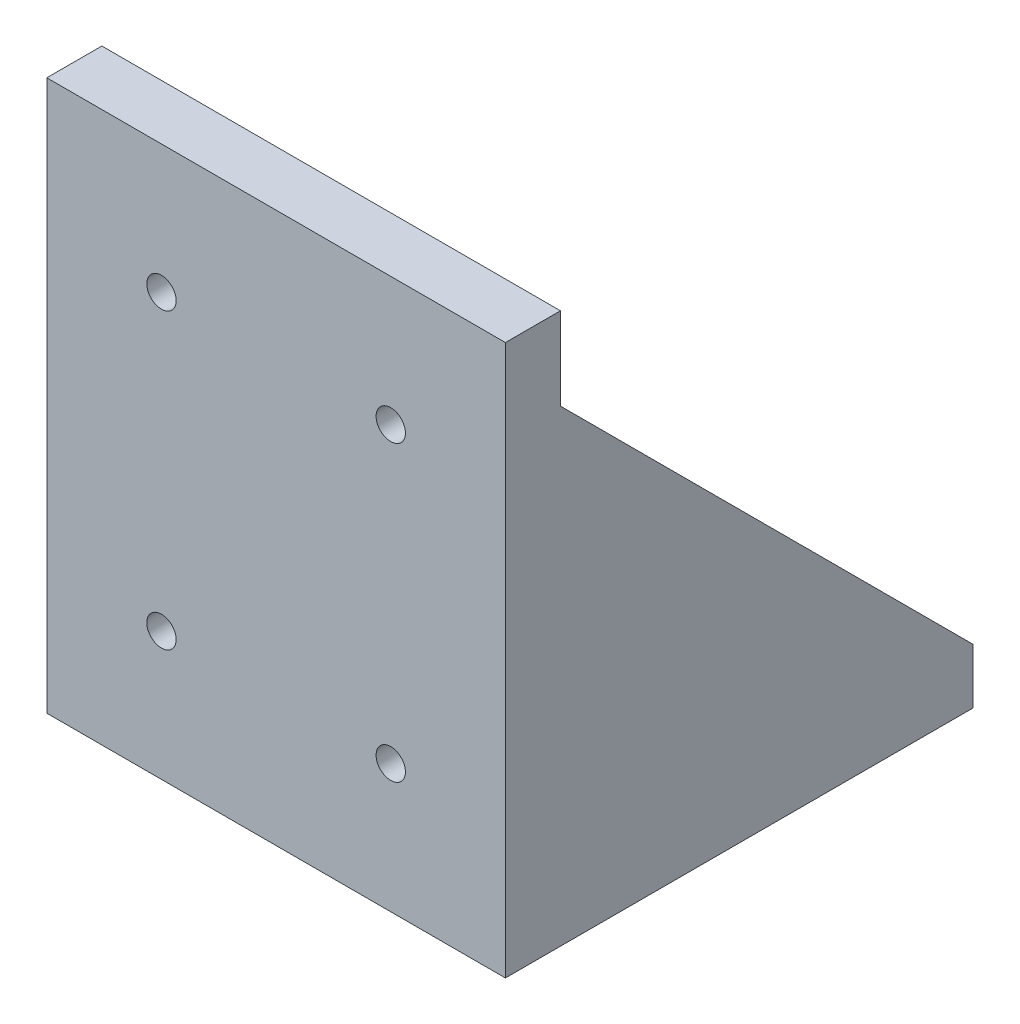
ISO-10303-21;
HEADER;
FILE_DESCRIPTION(('STEP AP214'),'2;1');
FILE_NAME('part.step','',(''),(''),'','','');
FILE_SCHEMA(('AUTOMOTIVE_DESIGN { 1 0 10303 214 1 1 1 1 }'));
ENDSEC;
DATA;
#1=APPLICATION_CONTEXT('core data for automotive mechanical design processes');
#2=APPLICATION_PROTOCOL_DEFINITION('international standard','automotive_design',2000,#1);
#3=PRODUCT_CONTEXT('',#1,'mechanical');
#4=PRODUCT('Part','Part','',(#3));
#5=PRODUCT_RELATED_PRODUCT_CATEGORY('part','',(#4));
#6=PRODUCT_DEFINITION_FORMATION('','',#4);
#7=PRODUCT_DEFINITION_CONTEXT('part definition',#1,'design');
#8=PRODUCT_DEFINITION('design','',#6,#7);
#9=PRODUCT_DEFINITION_SHAPE('','',#8);
#10=(LENGTH_UNIT() NAMED_UNIT(*) SI_UNIT(.MILLI.,.METRE.));
#11=(NAMED_UNIT(*) PLANE_ANGLE_UNIT() SI_UNIT($,.RADIAN.));
#12=(NAMED_UNIT(*) SI_UNIT($,.STERADIAN.) SOLID_ANGLE_UNIT());
#13=UNCERTAINTY_MEASURE_WITH_UNIT(LENGTH_MEASURE(1.E-05),#10,'distance_accuracy_value','');
#14=(GEOMETRIC_REPRESENTATION_CONTEXT(3) GLOBAL_UNCERTAINTY_ASSIGNED_CONTEXT((#13)) GLOBAL_UNIT_ASSIGNED_CONTEXT((#10,
#11,#12)) REPRESENTATION_CONTEXT('',''));
#15=CARTESIAN_POINT('',(0.,0.,0.));
#16=DIRECTION('',(0.,0.,1.));
#17=DIRECTION('',(1.,0.,0.));
#18=AXIS2_PLACEMENT_3D('',#15,#16,#17);
#19=CARTESIAN_POINT('',(12.5,46.,27.2));
#20=DIRECTION('',(0.,0.,-1.));
#21=DIRECTION('',(-1.,0.,0.));
#22=AXIS2_PLACEMENT_3D('',#19,#20,#21);
#23=CYLINDRICAL_SURFACE('',#22,1.6);
#24=CARTESIAN_POINT('',(12.5,46.,27.2));
#25=DIRECTION('',(0.,0.,-1.));
#26=DIRECTION('',(-1.,0.,0.));
#27=AXIS2_PLACEMENT_3D('',#24,#25,#26);
#28=CIRCLE('',#27,1.6);
#29=CARTESIAN_POINT('',(10.9,46.,27.2));
#30=VERTEX_POINT('',#29);
#31=EDGE_CURVE('E173',#30,#30,#28,.T.);
#32=ORIENTED_EDGE('',*,*,#31,.F.);
#33=EDGE_LOOP('',(#32));
#34=FACE_BOUND('',#33,.T.);
#35=CARTESIAN_POINT('',(12.5,46.,23.2));
#36=DIRECTION('',(0.,0.,-1.));
#37=DIRECTION('',(-1.,0.,0.));
#38=AXIS2_PLACEMENT_3D('',#35,#36,#37);
#39=CIRCLE('',#38,1.6);
#40=CARTESIAN_POINT('',(10.9,46.,23.2));
#41=VERTEX_POINT('',#40);
#42=EDGE_CURVE('E41',#41,#41,#39,.F.);
#43=ORIENTED_EDGE('',*,*,#42,.F.);
#44=EDGE_LOOP('',(#43));
#45=FACE_BOUND('',#44,.T.);
#46=ADVANCED_FACE('F37',(#34,#45),#23,.F.);
#47=CARTESIAN_POINT('',(12.5,14.,27.2));
#48=DIRECTION('',(0.,0.,-1.));
#49=DIRECTION('',(-1.,0.,0.));
#50=AXIS2_PLACEMENT_3D('',#47,#48,#49);
#51=CYLINDRICAL_SURFACE('',#50,1.6);
#52=CARTESIAN_POINT('',(12.5,14.,27.2));
#53=DIRECTION('',(0.,0.,-1.));
#54=DIRECTION('',(-1.,0.,0.));
#55=AXIS2_PLACEMENT_3D('',#52,#53,#54);
#56=CIRCLE('',#55,1.6);
#57=CARTESIAN_POINT('',(10.9,14.,27.2));
#58=VERTEX_POINT('',#57);
#59=EDGE_CURVE('E169',#58,#58,#56,.T.);
#60=ORIENTED_EDGE('',*,*,#59,.F.);
#61=EDGE_LOOP('',(#60));
#62=FACE_BOUND('',#61,.T.);
#63=CARTESIAN_POINT('',(12.5,14.,23.2));
#64=DIRECTION('',(0.,0.,-1.));
#65=DIRECTION('',(-1.,0.,0.));
#66=AXIS2_PLACEMENT_3D('',#63,#64,#65);
#67=CIRCLE('',#66,1.6);
#68=CARTESIAN_POINT('',(10.9,14.,23.2));
#69=VERTEX_POINT('',#68);
#70=EDGE_CURVE('E155',#69,#69,#67,.F.);
#71=ORIENTED_EDGE('',*,*,#70,.F.);
#72=EDGE_LOOP('',(#71));
#73=FACE_BOUND('',#72,.T.);
#74=ADVANCED_FACE('F266',(#62,#73),#51,.F.);
#75=CARTESIAN_POINT('',(-12.5,14.,27.2));
#76=DIRECTION('',(0.,0.,-1.));
#77=DIRECTION('',(-1.,0.,0.));
#78=AXIS2_PLACEMENT_3D('',#75,#76,#77);
#79=CYLINDRICAL_SURFACE('',#78,1.60000000000001);
#80=CARTESIAN_POINT('',(-12.5,14.,27.2));
#81=DIRECTION('',(0.,0.,-1.));
#82=DIRECTION('',(1.,0.,0.));
#83=AXIS2_PLACEMENT_3D('',#80,#81,#82);
#84=CIRCLE('',#83,1.60000000000001);
#85=CARTESIAN_POINT('',(-10.9,14.,27.2));
#86=VERTEX_POINT('',#85);
#87=EDGE_CURVE('E164',#86,#86,#84,.T.);
#88=ORIENTED_EDGE('',*,*,#87,.F.);
#89=EDGE_LOOP('',(#88));
#90=FACE_BOUND('',#89,.T.);
#91=CARTESIAN_POINT('',(-12.5,14.,23.2));
#92=DIRECTION('',(0.,0.,-1.));
#93=DIRECTION('',(-1.,0.,0.));
#94=AXIS2_PLACEMENT_3D('',#91,#92,#93);
#95=CIRCLE('',#94,1.60000000000001);
#96=CARTESIAN_POINT('',(-14.1,14.,23.2));
#97=VERTEX_POINT('',#96);
#98=EDGE_CURVE('E152',#97,#97,#95,.F.);
#99=ORIENTED_EDGE('',*,*,#98,.F.);
#100=EDGE_LOOP('',(#99));
#101=FACE_BOUND('',#100,.T.);
#102=ADVANCED_FACE('F272',(#90,#101),#79,.F.);
#103=CARTESIAN_POINT('',(-12.5,46.,27.2));
#104=DIRECTION('',(0.,0.,-1.));
#105=DIRECTION('',(-1.,0.,0.));
#106=AXIS2_PLACEMENT_3D('',#103,#104,#105);
#107=CYLINDRICAL_SURFACE('',#106,1.60000000000002);
#108=CARTESIAN_POINT('',(-12.5,46.,27.2));
#109=DIRECTION('',(0.,0.,-1.));
#110=DIRECTION('',(1.,0.,0.));
#111=AXIS2_PLACEMENT_3D('',#108,#109,#110);
#112=CIRCLE('',#111,1.60000000000002);
#113=CARTESIAN_POINT('',(-10.9,46.,27.2));
#114=VERTEX_POINT('',#113);
#115=EDGE_CURVE('E160',#114,#114,#112,.T.);
#116=ORIENTED_EDGE('',*,*,#115,.F.);
#117=EDGE_LOOP('',(#116));
#118=FACE_BOUND('',#117,.T.);
#119=CARTESIAN_POINT('',(-12.5,46.,23.2));
#120=DIRECTION('',(0.,0.,-1.));
#121=DIRECTION('',(-1.,0.,0.));
#122=AXIS2_PLACEMENT_3D('',#119,#120,#121);
#123=CIRCLE('',#122,1.60000000000002);
#124=CARTESIAN_POINT('',(-14.1,46.,23.2));
#125=VERTEX_POINT('',#124);
#126=EDGE_CURVE('E149',#125,#125,#123,.F.);
#127=ORIENTED_EDGE('',*,*,#126,.F.);
#128=EDGE_LOOP('',(#127));
#129=FACE_BOUND('',#128,.T.);
#130=ADVANCED_FACE('F279',(#118,#129),#107,.F.);
#131=CARTESIAN_POINT('',(0.,6.,0.));
#132=DIRECTION('',(0.,1.,0.));
#133=DIRECTION('',(0.,0.,1.));
#134=AXIS2_PLACEMENT_3D('',#131,#132,#133);
#135=PLANE('',#134);
#136=CARTESIAN_POINT('',(-15.5,6.,15.5));
#137=DIRECTION('',(0.,1.,0.));
#138=DIRECTION('',(0.,0.,1.));
#139=AXIS2_PLACEMENT_3D('',#136,#137,#138);
#140=CIRCLE('',#139,1.65);
#141=CARTESIAN_POINT('',(-15.5,6.,17.15));
#142=VERTEX_POINT('',#141);
#143=EDGE_CURVE('E225',#142,#142,#140,.T.);
#144=ORIENTED_EDGE('',*,*,#143,.F.);
#145=EDGE_LOOP('',(#144));
#146=FACE_BOUND('',#145,.T.);
#147=CARTESIAN_POINT('',(15.5,6.,-15.5));
#148=DIRECTION('',(0.,1.,0.));
#149=DIRECTION('',(0.,0.,1.));
#150=AXIS2_PLACEMENT_3D('',#147,#148,#149);
#151=CIRCLE('',#150,1.65);
#152=CARTESIAN_POINT('',(15.5,6.,-13.85));
#153=VERTEX_POINT('',#152);
#154=EDGE_CURVE('E237',#153,#153,#151,.T.);
#155=ORIENTED_EDGE('',*,*,#154,.F.);
#156=EDGE_LOOP('',(#155));
#157=FACE_BOUND('',#156,.T.);
#158=CARTESIAN_POINT('',(-15.5,6.,-15.5));
#159=DIRECTION('',(0.,1.,0.));
#160=DIRECTION('',(0.,0.,1.));
#161=AXIS2_PLACEMENT_3D('',#158,#159,#160);
#162=CIRCLE('',#161,1.65);
#163=CARTESIAN_POINT('',(-15.5,6.,-13.85));
#164=VERTEX_POINT('',#163);
#165=EDGE_CURVE('E146',#164,#164,#162,.T.);
#166=ORIENTED_EDGE('',*,*,#165,.F.);
#167=EDGE_LOOP('',(#166));
#168=FACE_BOUND('',#167,.T.);
#169=CARTESIAN_POINT('',(15.5,6.,15.5));
#170=DIRECTION('',(0.,1.,0.));
#171=DIRECTION('',(0.,0.,1.));
#172=AXIS2_PLACEMENT_3D('',#169,#170,#171);
#173=CIRCLE('',#172,1.65);
#174=CARTESIAN_POINT('',(15.5,6.,17.15));
#175=VERTEX_POINT('',#174);
#176=EDGE_CURVE('E231',#175,#175,#173,.T.);
#177=ORIENTED_EDGE('',*,*,#176,.F.);
#178=EDGE_LOOP('',(#177));
#179=FACE_BOUND('',#178,.T.);
#180=CARTESIAN_POINT('',(0.,6.,0.));
#181=DIRECTION('',(0.,1.,0.));
#182=DIRECTION('',(0.,0.,1.));
#183=AXIS2_PLACEMENT_3D('',#180,#181,#182);
#184=CIRCLE('',#183,13.);
#185=CARTESIAN_POINT('',(0.,6.,13.));
#186=VERTEX_POINT('',#185);
#187=EDGE_CURVE('E219',#186,#186,#184,.T.);
#188=ORIENTED_EDGE('',*,*,#187,.F.);
#189=EDGE_LOOP('',(#188));
#190=FACE_BOUND('',#189,.T.);
#191=DIRECTION('',(1.,0.,0.));
#192=VECTOR('',#191,1.);
#193=CARTESIAN_POINT('',(-25.,6.,21.2));
#194=LINE('',#193,#192);
#195=CARTESIAN_POINT('',(-22.,6.,21.2));
#196=VERTEX_POINT('',#195);
#197=CARTESIAN_POINT('',(22.,6.,21.2));
#198=VERTEX_POINT('',#197);
#199=EDGE_CURVE('E123',#196,#198,#194,.T.);
#200=ORIENTED_EDGE('',*,*,#199,.T.);
#201=DIRECTION('',(0.,0.,1.));
#202=VECTOR('',#201,1.);
#203=CARTESIAN_POINT('',(22.,6.,21.2));
#204=LINE('',#203,#202);
#205=CARTESIAN_POINT('',(22.,6.,-23.8));
#206=VERTEX_POINT('',#205);
#207=EDGE_CURVE('E112',#206,#198,#204,.T.);
#208=ORIENTED_EDGE('',*,*,#207,.F.);
#209=DIRECTION('',(-1.,0.,0.));
#210=VECTOR('',#209,1.);
#211=CARTESIAN_POINT('',(25.,6.,-23.8));
#212=LINE('',#211,#210);
#213=CARTESIAN_POINT('',(-22.,6.,-23.8));
#214=VERTEX_POINT('',#213);
#215=EDGE_CURVE('E124',#206,#214,#212,.T.);
#216=ORIENTED_EDGE('',*,*,#215,.T.);
#217=DIRECTION('',(0.,0.,1.));
#218=VECTOR('',#217,1.);
#219=CARTESIAN_POINT('',(-22.,6.,21.2));
#220=LINE('',#219,#218);
#221=EDGE_CURVE('E181',#214,#196,#220,.T.);
#222=ORIENTED_EDGE('',*,*,#221,.T.);
#223=EDGE_LOOP('',(#200,#208,#216,#222));
#224=FACE_BOUND('',#223,.T.);
#225=ADVANCED_FACE('F128',(#146,#157,#168,#179,#190,#224),#135,.T.);
#226=CARTESIAN_POINT('',(0.,0.,21.2));
#227=DIRECTION('',(0.,0.,-1.));
#228=DIRECTION('',(-1.,0.,0.));
#229=AXIS2_PLACEMENT_3D('',#226,#227,#228);
#230=PLANE('',#229);
#231=CARTESIAN_POINT('',(-12.5,46.,21.2));
#232=DIRECTION('',(0.,0.,-1.));
#233=DIRECTION('',(-1.,0.,0.));
#234=AXIS2_PLACEMENT_3D('',#231,#232,#233);
#235=CIRCLE('',#234,3.5);
#236=CARTESIAN_POINT('',(-16.,46.,21.2));
#237=VERTEX_POINT('',#236);
#238=EDGE_CURVE('E509',#237,#237,#235,.T.);
#239=ORIENTED_EDGE('',*,*,#238,.F.);
#240=EDGE_LOOP('',(#239));
#241=FACE_BOUND('',#240,.T.);
#242=CARTESIAN_POINT('',(12.5,14.,21.2));
#243=DIRECTION('',(0.,0.,-1.));
#244=DIRECTION('',(-1.,0.,0.));
#245=AXIS2_PLACEMENT_3D('',#242,#243,#244);
#246=CIRCLE('',#245,3.5);
#247=CARTESIAN_POINT('',(9.,14.,21.2));
#248=VERTEX_POINT('',#247);
#249=EDGE_CURVE('E517',#248,#248,#246,.T.);
#250=ORIENTED_EDGE('',*,*,#249,.F.);
#251=EDGE_LOOP('',(#250));
#252=FACE_BOUND('',#251,.T.);
#253=CARTESIAN_POINT('',(-12.5,14.,21.2));
#254=DIRECTION('',(0.,0.,-1.));
#255=DIRECTION('',(-1.,0.,0.));
#256=AXIS2_PLACEMENT_3D('',#253,#254,#255);
#257=CIRCLE('',#256,3.5);
#258=CARTESIAN_POINT('',(-16.,14.,21.2));
#259=VERTEX_POINT('',#258);
#260=EDGE_CURVE('E526',#259,#259,#257,.T.);
#261=ORIENTED_EDGE('',*,*,#260,.F.);
#262=EDGE_LOOP('',(#261));
#263=FACE_BOUND('',#262,.T.);
#264=CARTESIAN_POINT('',(12.5,46.,21.2));
#265=DIRECTION('',(0.,0.,-1.));
#266=DIRECTION('',(-1.,0.,0.));
#267=AXIS2_PLACEMENT_3D('',#264,#265,#266);
#268=CIRCLE('',#267,3.5);
#269=CARTESIAN_POINT('',(8.99999999999999,46.,21.2));
#270=VERTEX_POINT('',#269);
#271=EDGE_CURVE('E503',#270,#270,#268,.T.);
#272=ORIENTED_EDGE('',*,*,#271,.F.);
#273=EDGE_LOOP('',(#272));
#274=FACE_BOUND('',#273,.T.);
#275=DIRECTION('',(0.,1.,0.));
#276=VECTOR('',#275,1.);
#277=CARTESIAN_POINT('',(25.,0.,21.2));
#278=LINE('',#277,#276);
#279=CARTESIAN_POINT('',(25.,50.9999999999995,21.2));
#280=VERTEX_POINT('',#279);
#281=CARTESIAN_POINT('',(25.,60.,21.2));
#282=VERTEX_POINT('',#281);
#283=EDGE_CURVE('E210',#280,#282,#278,.T.);
#284=ORIENTED_EDGE('',*,*,#283,.F.);
#285=DIRECTION('',(1.,0.,0.));
#286=VECTOR('',#285,1.);
#287=CARTESIAN_POINT('',(22.,50.9999999999995,21.2));
#288=LINE('',#287,#286);
#289=CARTESIAN_POINT('',(22.,50.9999999999995,21.2));
#290=VERTEX_POINT('',#289);
#291=EDGE_CURVE('E177',#290,#280,#288,.T.);
#292=ORIENTED_EDGE('',*,*,#291,.F.);
#293=DIRECTION('',(0.,1.,0.));
#294=VECTOR('',#293,1.);
#295=CARTESIAN_POINT('',(22.,50.9999999999995,21.2));
#296=LINE('',#295,#294);
#297=EDGE_CURVE('E114',#198,#290,#296,.T.);
#298=ORIENTED_EDGE('',*,*,#297,.F.);
#299=ORIENTED_EDGE('',*,*,#199,.F.);
#300=DIRECTION('',(0.,1.,0.));
#301=VECTOR('',#300,1.);
#302=CARTESIAN_POINT('',(-22.,50.9999999999995,21.2));
#303=LINE('',#302,#301);
#304=CARTESIAN_POINT('',(-22.,50.9999999999995,21.2));
#305=VERTEX_POINT('',#304);
#306=EDGE_CURVE('E183',#196,#305,#303,.T.);
#307=ORIENTED_EDGE('',*,*,#306,.T.);
#308=DIRECTION('',(-1.,0.,0.));
#309=VECTOR('',#308,1.);
#310=CARTESIAN_POINT('',(-22.,50.9999999999995,21.2));
#311=LINE('',#310,#309);
#312=CARTESIAN_POINT('',(-25.,50.9999999999995,21.2));
#313=VERTEX_POINT('',#312);
#314=EDGE_CURVE('E189',#305,#313,#311,.T.);
#315=ORIENTED_EDGE('',*,*,#314,.T.);
#316=DIRECTION('',(0.,-1.,0.));
#317=VECTOR('',#316,1.);
#318=CARTESIAN_POINT('',(-25.,0.,21.2));
#319=LINE('',#318,#317);
#320=CARTESIAN_POINT('',(-25.,60.,21.2));
#321=VERTEX_POINT('',#320);
#322=EDGE_CURVE('E193',#321,#313,#319,.T.);
#323=ORIENTED_EDGE('',*,*,#322,.F.);
#324=DIRECTION('',(-1.,0.,0.));
#325=VECTOR('',#324,1.);
#326=CARTESIAN_POINT('',(-25.,60.,21.2));
#327=LINE('',#326,#325);
#328=EDGE_CURVE('E200',#282,#321,#327,.T.);
#329=ORIENTED_EDGE('',*,*,#328,.F.);
#330=EDGE_LOOP('',(#284,#292,#298,#299,#307,#315,#323,#329));
#331=FACE_BOUND('',#330,.T.);
#332=ADVANCED_FACE('F298',(#241,#252,#263,#274,#331),#230,.T.);
#333=CARTESIAN_POINT('',(0.,0.,0.));
#334=DIRECTION('',(0.,1.,0.));
#335=DIRECTION('',(0.,0.,1.));
#336=AXIS2_PLACEMENT_3D('',#333,#334,#335);
#337=PLANE('',#336);
#338=DIRECTION('',(-1.,0.,0.));
#339=VECTOR('',#338,1.);
#340=CARTESIAN_POINT('',(25.,0.,-23.8));
#341=LINE('',#340,#339);
#342=CARTESIAN_POINT('',(25.,0.,-23.8));
#343=VERTEX_POINT('',#342);
#344=CARTESIAN_POINT('',(-25.,0.,-23.8));
#345=VERTEX_POINT('',#344);
#346=EDGE_CURVE('E144',#343,#345,#341,.T.);
#347=ORIENTED_EDGE('',*,*,#346,.F.);
#348=DIRECTION('',(0.,0.,-1.));
#349=VECTOR('',#348,1.);
#350=CARTESIAN_POINT('',(25.,0.,21.2));
#351=LINE('',#350,#349);
#352=CARTESIAN_POINT('',(25.,0.,27.2));
#353=VERTEX_POINT('',#352);
#354=EDGE_CURVE('E60',#353,#343,#351,.T.);
#355=ORIENTED_EDGE('',*,*,#354,.F.);
#356=DIRECTION('',(1.,0.,0.));
#357=VECTOR('',#356,1.);
#358=CARTESIAN_POINT('',(-25.,0.,27.2));
#359=LINE('',#358,#357);
#360=CARTESIAN_POINT('',(-25.,0.,27.2));
#361=VERTEX_POINT('',#360);
#362=EDGE_CURVE('E199',#361,#353,#359,.T.);
#363=ORIENTED_EDGE('',*,*,#362,.F.);
#364=DIRECTION('',(0.,0.,1.));
#365=VECTOR('',#364,1.);
#366=CARTESIAN_POINT('',(-25.,0.,-23.8));
#367=LINE('',#366,#365);
#368=EDGE_CURVE('E137',#345,#361,#367,.T.);
#369=ORIENTED_EDGE('',*,*,#368,.F.);
#370=EDGE_LOOP('',(#347,#355,#363,#369));
#371=FACE_BOUND('',#370,.T.);
#372=CARTESIAN_POINT('',(-15.5,0.,-15.5));
#373=DIRECTION('',(0.,1.,0.));
#374=DIRECTION('',(0.,0.,1.));
#375=AXIS2_PLACEMENT_3D('',#372,#373,#374);
#376=CIRCLE('',#375,1.65);
#377=CARTESIAN_POINT('',(-15.5,0.,-13.85));
#378=VERTEX_POINT('',#377);
#379=EDGE_CURVE('E141',#378,#378,#376,.T.);
#380=ORIENTED_EDGE('',*,*,#379,.T.);
#381=EDGE_LOOP('',(#380));
#382=FACE_BOUND('',#381,.T.);
#383=CARTESIAN_POINT('',(15.5,0.,-15.5));
#384=DIRECTION('',(0.,1.,0.));
#385=DIRECTION('',(0.,0.,1.));
#386=AXIS2_PLACEMENT_3D('',#383,#384,#385);
#387=CIRCLE('',#386,1.65);
#388=CARTESIAN_POINT('',(15.5,0.,-13.85));
#389=VERTEX_POINT('',#388);
#390=EDGE_CURVE('E234',#389,#389,#387,.T.);
#391=ORIENTED_EDGE('',*,*,#390,.T.);
#392=EDGE_LOOP('',(#391));
#393=FACE_BOUND('',#392,.T.);
#394=CARTESIAN_POINT('',(15.5,0.,15.5));
#395=DIRECTION('',(0.,1.,0.));
#396=DIRECTION('',(0.,0.,1.));
#397=AXIS2_PLACEMENT_3D('',#394,#395,#396);
#398=CIRCLE('',#397,1.65);
#399=CARTESIAN_POINT('',(15.5,0.,17.15));
#400=VERTEX_POINT('',#399);
#401=EDGE_CURVE('E228',#400,#400,#398,.T.);
#402=ORIENTED_EDGE('',*,*,#401,.T.);
#403=EDGE_LOOP('',(#402));
#404=FACE_BOUND('',#403,.T.);
#405=CARTESIAN_POINT('',(-15.5,0.,15.5));
#406=DIRECTION('',(0.,1.,0.));
#407=DIRECTION('',(0.,0.,1.));
#408=AXIS2_PLACEMENT_3D('',#405,#406,#407);
#409=CIRCLE('',#408,1.65);
#410=CARTESIAN_POINT('',(-15.5,0.,17.15));
#411=VERTEX_POINT('',#410);
#412=EDGE_CURVE('E222',#411,#411,#409,.T.);
#413=ORIENTED_EDGE('',*,*,#412,.T.);
#414=EDGE_LOOP('',(#413));
#415=FACE_BOUND('',#414,.T.);
#416=CARTESIAN_POINT('',(0.,0.,0.));
#417=DIRECTION('',(0.,1.,0.));
#418=DIRECTION('',(0.,0.,1.));
#419=AXIS2_PLACEMENT_3D('',#416,#417,#418);
#420=CIRCLE('',#419,13.);
#421=CARTESIAN_POINT('',(0.,0.,13.));
#422=VERTEX_POINT('',#421);
#423=EDGE_CURVE('E218',#422,#422,#420,.T.);
#424=ORIENTED_EDGE('',*,*,#423,.T.);
#425=EDGE_LOOP('',(#424));
#426=FACE_BOUND('',#425,.T.);
#427=ADVANCED_FACE('F247',(#371,#382,#393,#404,#415,#426),#337,.F.);
#428=CARTESIAN_POINT('',(25.,6.,-23.8));
#429=DIRECTION('',(0.,0.,1.));
#430=DIRECTION('',(1.,0.,0.));
#431=AXIS2_PLACEMENT_3D('',#428,#429,#430);
#432=PLANE('',#431);
#433=ORIENTED_EDGE('',*,*,#346,.T.);
#434=DIRECTION('',(0.,-1.,0.));
#435=VECTOR('',#434,1.);
#436=CARTESIAN_POINT('',(-25.,6.,-23.8));
#437=LINE('',#436,#435);
#438=CARTESIAN_POINT('',(-25.,6.,-23.8));
#439=VERTEX_POINT('',#438);
#440=EDGE_CURVE('E11',#439,#345,#437,.T.);
#441=ORIENTED_EDGE('',*,*,#440,.F.);
#442=DIRECTION('',(-1.,0.,0.));
#443=VECTOR('',#442,1.);
#444=CARTESIAN_POINT('',(-22.,6.,-23.8));
#445=LINE('',#444,#443);
#446=EDGE_CURVE('E136',#214,#439,#445,.T.);
#447=ORIENTED_EDGE('',*,*,#446,.F.);
#448=ORIENTED_EDGE('',*,*,#215,.F.);
#449=CARTESIAN_POINT('',(25.,6.,-23.8));
#450=VERTEX_POINT('',#449);
#451=EDGE_CURVE('E119',#450,#206,#212,.T.);
#452=ORIENTED_EDGE('',*,*,#451,.F.);
#453=DIRECTION('',(0.,-1.,0.));
#454=VECTOR('',#453,1.);
#455=CARTESIAN_POINT('',(25.,6.,-23.8));
#456=LINE('',#455,#454);
#457=EDGE_CURVE('E46',#450,#343,#456,.T.);
#458=ORIENTED_EDGE('',*,*,#457,.T.);
#459=EDGE_LOOP('',(#433,#441,#447,#448,#452,#458));
#460=FACE_BOUND('',#459,.T.);
#461=ADVANCED_FACE('F39',(#460),#432,.F.);
#462=CARTESIAN_POINT('',(-25.,6.,-23.8));
#463=DIRECTION('',(1.,0.,0.));
#464=DIRECTION('',(0.,0.,-1.));
#465=AXIS2_PLACEMENT_3D('',#462,#463,#464);
#466=PLANE('',#465);
#467=ORIENTED_EDGE('',*,*,#368,.T.);
#468=DIRECTION('',(0.,-1.,0.));
#469=VECTOR('',#468,1.);
#470=CARTESIAN_POINT('',(-25.,0.,27.2));
#471=LINE('',#470,#469);
#472=CARTESIAN_POINT('',(-25.,60.,27.2));
#473=VERTEX_POINT('',#472);
#474=EDGE_CURVE('E196',#473,#361,#471,.T.);
#475=ORIENTED_EDGE('',*,*,#474,.F.);
#476=DIRECTION('',(0.,0.,-1.));
#477=VECTOR('',#476,1.);
#478=CARTESIAN_POINT('',(-25.,60.,27.2));
#479=LINE('',#478,#477);
#480=EDGE_CURVE('E207',#473,#321,#479,.T.);
#481=ORIENTED_EDGE('',*,*,#480,.T.);
#482=ORIENTED_EDGE('',*,*,#322,.T.);
#483=DIRECTION('',(0.,-0.707106781186544,-0.707106781186551));
#484=VECTOR('',#483,1.);
#485=CARTESIAN_POINT('',(-25.,6.,-23.8));
#486=LINE('',#485,#484);
#487=EDGE_CURVE('E180',#313,#439,#486,.T.);
#488=ORIENTED_EDGE('',*,*,#487,.T.);
#489=ORIENTED_EDGE('',*,*,#440,.T.);
#490=EDGE_LOOP('',(#467,#475,#481,#482,#488,#489));
#491=FACE_BOUND('',#490,.T.);
#492=ADVANCED_FACE('F262',(#491),#466,.F.);
#493=CARTESIAN_POINT('',(25.,6.,21.2));
#494=DIRECTION('',(-1.,0.,0.));
#495=DIRECTION('',(0.,0.,1.));
#496=AXIS2_PLACEMENT_3D('',#493,#494,#495);
#497=PLANE('',#496);
#498=ORIENTED_EDGE('',*,*,#457,.F.);
#499=DIRECTION('',(0.,-0.707106781186544,-0.707106781186551));
#500=VECTOR('',#499,1.);
#501=CARTESIAN_POINT('',(25.,6.,-23.8));
#502=LINE('',#501,#500);
#503=EDGE_CURVE('E54',#280,#450,#502,.T.);
#504=ORIENTED_EDGE('',*,*,#503,.F.);
#505=ORIENTED_EDGE('',*,*,#283,.T.);
#506=DIRECTION('',(0.,0.,-1.));
#507=VECTOR('',#506,1.);
#508=CARTESIAN_POINT('',(25.,60.,27.2));
#509=LINE('',#508,#507);
#510=CARTESIAN_POINT('',(25.,60.,27.2));
#511=VERTEX_POINT('',#510);
#512=EDGE_CURVE('E215',#511,#282,#509,.T.);
#513=ORIENTED_EDGE('',*,*,#512,.F.);
#514=DIRECTION('',(0.,1.,0.));
#515=VECTOR('',#514,1.);
#516=CARTESIAN_POINT('',(25.,0.,27.2));
#517=LINE('',#516,#515);
#518=EDGE_CURVE('E203',#353,#511,#517,.T.);
#519=ORIENTED_EDGE('',*,*,#518,.F.);
#520=ORIENTED_EDGE('',*,*,#354,.T.);
#521=EDGE_LOOP('',(#498,#504,#505,#513,#519,#520));
#522=FACE_BOUND('',#521,.T.);
#523=ADVANCED_FACE('F253',(#522),#497,.F.);
#524=CARTESIAN_POINT('',(-15.5,6.,-15.5));
#525=DIRECTION('',(0.,-1.,0.));
#526=DIRECTION('',(0.,0.,-1.));
#527=AXIS2_PLACEMENT_3D('',#524,#525,#526);
#528=CYLINDRICAL_SURFACE('',#527,1.65);
#529=ORIENTED_EDGE('',*,*,#165,.T.);
#530=EDGE_LOOP('',(#529));
#531=FACE_BOUND('',#530,.T.);
#532=ORIENTED_EDGE('',*,*,#379,.F.);
#533=EDGE_LOOP('',(#532));
#534=FACE_BOUND('',#533,.T.);
#535=ADVANCED_FACE('F250',(#531,#534),#528,.F.);
#536=CARTESIAN_POINT('',(15.5,6.,-15.5));
#537=DIRECTION('',(0.,-1.,0.));
#538=DIRECTION('',(0.,0.,-1.));
#539=AXIS2_PLACEMENT_3D('',#536,#537,#538);
#540=CYLINDRICAL_SURFACE('',#539,1.65);
#541=ORIENTED_EDGE('',*,*,#154,.T.);
#542=EDGE_LOOP('',(#541));
#543=FACE_BOUND('',#542,.T.);
#544=ORIENTED_EDGE('',*,*,#390,.F.);
#545=EDGE_LOOP('',(#544));
#546=FACE_BOUND('',#545,.T.);
#547=ADVANCED_FACE('F252',(#543,#546),#540,.F.);
#548=CARTESIAN_POINT('',(15.5,6.,15.5));
#549=DIRECTION('',(0.,-1.,0.));
#550=DIRECTION('',(0.,0.,-1.));
#551=AXIS2_PLACEMENT_3D('',#548,#549,#550);
#552=CYLINDRICAL_SURFACE('',#551,1.65);
#553=ORIENTED_EDGE('',*,*,#176,.T.);
#554=EDGE_LOOP('',(#553));
#555=FACE_BOUND('',#554,.T.);
#556=ORIENTED_EDGE('',*,*,#401,.F.);
#557=EDGE_LOOP('',(#556));
#558=FACE_BOUND('',#557,.T.);
#559=ADVANCED_FACE('F259',(#555,#558),#552,.F.);
#560=CARTESIAN_POINT('',(-15.5,6.,15.5));
#561=DIRECTION('',(0.,-1.,0.));
#562=DIRECTION('',(0.,0.,-1.));
#563=AXIS2_PLACEMENT_3D('',#560,#561,#562);
#564=CYLINDRICAL_SURFACE('',#563,1.65);
#565=ORIENTED_EDGE('',*,*,#143,.T.);
#566=EDGE_LOOP('',(#565));
#567=FACE_BOUND('',#566,.T.);
#568=ORIENTED_EDGE('',*,*,#412,.F.);
#569=EDGE_LOOP('',(#568));
#570=FACE_BOUND('',#569,.T.);
#571=ADVANCED_FACE('F308',(#567,#570),#564,.F.);
#572=CARTESIAN_POINT('',(0.,6.,0.));
#573=DIRECTION('',(0.,-1.,0.));
#574=DIRECTION('',(0.,0.,-1.));
#575=AXIS2_PLACEMENT_3D('',#572,#573,#574);
#576=CYLINDRICAL_SURFACE('',#575,13.);
#577=ORIENTED_EDGE('',*,*,#187,.T.);
#578=EDGE_LOOP('',(#577));
#579=FACE_BOUND('',#578,.T.);
#580=ORIENTED_EDGE('',*,*,#423,.F.);
#581=EDGE_LOOP('',(#580));
#582=FACE_BOUND('',#581,.T.);
#583=ADVANCED_FACE('F304',(#579,#582),#576,.F.);
#584=CARTESIAN_POINT('',(-25.,60.,27.2));
#585=DIRECTION('',(0.,-1.,0.));
#586=DIRECTION('',(0.,0.,-1.));
#587=AXIS2_PLACEMENT_3D('',#584,#585,#586);
#588=PLANE('',#587);
#589=ORIENTED_EDGE('',*,*,#328,.T.);
#590=ORIENTED_EDGE('',*,*,#480,.F.);
#591=DIRECTION('',(-1.,0.,0.));
#592=VECTOR('',#591,1.);
#593=CARTESIAN_POINT('',(-25.,60.,27.2));
#594=LINE('',#593,#592);
#595=EDGE_CURVE('E205',#511,#473,#594,.T.);
#596=ORIENTED_EDGE('',*,*,#595,.F.);
#597=ORIENTED_EDGE('',*,*,#512,.T.);
#598=EDGE_LOOP('',(#589,#590,#596,#597));
#599=FACE_BOUND('',#598,.T.);
#600=ADVANCED_FACE('F297',(#599),#588,.F.);
#601=CARTESIAN_POINT('',(0.,0.,27.2));
#602=DIRECTION('',(0.,0.,-1.));
#603=DIRECTION('',(-1.,0.,0.));
#604=AXIS2_PLACEMENT_3D('',#601,#602,#603);
#605=PLANE('',#604);
#606=ORIENTED_EDGE('',*,*,#115,.T.);
#607=EDGE_LOOP('',(#606));
#608=FACE_BOUND('',#607,.T.);
#609=ORIENTED_EDGE('',*,*,#87,.T.);
#610=EDGE_LOOP('',(#609));
#611=FACE_BOUND('',#610,.T.);
#612=ORIENTED_EDGE('',*,*,#59,.T.);
#613=EDGE_LOOP('',(#612));
#614=FACE_BOUND('',#613,.T.);
#615=ORIENTED_EDGE('',*,*,#31,.T.);
#616=EDGE_LOOP('',(#615));
#617=FACE_BOUND('',#616,.T.);
#618=ORIENTED_EDGE('',*,*,#474,.T.);
#619=ORIENTED_EDGE('',*,*,#362,.T.);
#620=ORIENTED_EDGE('',*,*,#518,.T.);
#621=ORIENTED_EDGE('',*,*,#595,.T.);
#622=EDGE_LOOP('',(#618,#619,#620,#621));
#623=FACE_BOUND('',#622,.T.);
#624=ADVANCED_FACE('F293',(#608,#611,#614,#617,#623),#605,.F.);
#625=CARTESIAN_POINT('',(-22.,6.,-23.8));
#626=DIRECTION('',(0.,0.707106781186551,-0.707106781186544));
#627=DIRECTION('',(0.,0.707106781186544,0.707106781186551));
#628=AXIS2_PLACEMENT_3D('',#625,#626,#627);
#629=PLANE('',#628);
#630=ORIENTED_EDGE('',*,*,#487,.F.);
#631=ORIENTED_EDGE('',*,*,#314,.F.);
#632=DIRECTION('',(0.,-0.707106781186544,-0.707106781186551));
#633=VECTOR('',#632,1.);
#634=CARTESIAN_POINT('',(-22.,6.,-23.8));
#635=LINE('',#634,#633);
#636=EDGE_CURVE('E186',#305,#214,#635,.T.);
#637=ORIENTED_EDGE('',*,*,#636,.T.);
#638=ORIENTED_EDGE('',*,*,#446,.T.);
#639=EDGE_LOOP('',(#630,#631,#637,#638));
#640=FACE_BOUND('',#639,.T.);
#641=ADVANCED_FACE('F289',(#640),#629,.T.);
#642=CARTESIAN_POINT('',(-22.,0.,0.));
#643=DIRECTION('',(-1.,0.,0.));
#644=DIRECTION('',(0.,0.,1.));
#645=AXIS2_PLACEMENT_3D('',#642,#643,#644);
#646=PLANE('',#645);
#647=ORIENTED_EDGE('',*,*,#221,.F.);
#648=ORIENTED_EDGE('',*,*,#636,.F.);
#649=ORIENTED_EDGE('',*,*,#306,.F.);
#650=EDGE_LOOP('',(#647,#648,#649));
#651=FACE_BOUND('',#650,.T.);
#652=ADVANCED_FACE('F286',(#651),#646,.F.);
#653=CARTESIAN_POINT('',(22.,6.,-23.8));
#654=DIRECTION('',(0.,-0.707106781186551,0.707106781186544));
#655=DIRECTION('',(0.,-0.707106781186544,-0.707106781186551));
#656=AXIS2_PLACEMENT_3D('',#653,#654,#655);
#657=PLANE('',#656);
#658=ORIENTED_EDGE('',*,*,#503,.T.);
#659=ORIENTED_EDGE('',*,*,#451,.T.);
#660=DIRECTION('',(0.,-0.707106781186544,-0.707106781186551));
#661=VECTOR('',#660,1.);
#662=CARTESIAN_POINT('',(22.,6.,-23.8));
#663=LINE('',#662,#661);
#664=EDGE_CURVE('E108',#290,#206,#663,.T.);
#665=ORIENTED_EDGE('',*,*,#664,.F.);
#666=ORIENTED_EDGE('',*,*,#291,.T.);
#667=EDGE_LOOP('',(#658,#659,#665,#666));
#668=FACE_BOUND('',#667,.T.);
#669=ADVANCED_FACE('F120',(#668),#657,.F.);
#670=CARTESIAN_POINT('',(22.,0.,0.));
#671=DIRECTION('',(1.,0.,0.));
#672=DIRECTION('',(0.,0.,1.));
#673=AXIS2_PLACEMENT_3D('',#670,#671,#672);
#674=PLANE('',#673);
#675=ORIENTED_EDGE('',*,*,#207,.T.);
#676=ORIENTED_EDGE('',*,*,#297,.T.);
#677=ORIENTED_EDGE('',*,*,#664,.T.);
#678=EDGE_LOOP('',(#675,#676,#677));
#679=FACE_BOUND('',#678,.T.);
#680=ADVANCED_FACE('F110',(#679),#674,.F.);
#681=CARTESIAN_POINT('',(-12.5,46.,23.2));
#682=DIRECTION('',(0.,0.,-1.));
#683=DIRECTION('',(-1.,0.,0.));
#684=AXIS2_PLACEMENT_3D('',#681,#682,#683);
#685=PLANE('',#684);
#686=CARTESIAN_POINT('',(-12.5,46.,23.2));
#687=DIRECTION('',(0.,0.,-1.));
#688=DIRECTION('',(-1.,0.,0.));
#689=AXIS2_PLACEMENT_3D('',#686,#687,#688);
#690=CIRCLE('',#689,3.5);
#691=CARTESIAN_POINT('',(-16.,46.,23.2));
#692=VERTEX_POINT('',#691);
#693=EDGE_CURVE('E505',#692,#692,#690,.T.);
#694=ORIENTED_EDGE('',*,*,#693,.T.);
#695=EDGE_LOOP('',(#694));
#696=FACE_BOUND('',#695,.T.);
#697=ORIENTED_EDGE('',*,*,#126,.T.);
#698=EDGE_LOOP('',(#697));
#699=FACE_BOUND('',#698,.T.);
#700=ADVANCED_FACE('F283',(#696,#699),#685,.T.);
#701=CARTESIAN_POINT('',(-12.5,46.,23.2));
#702=DIRECTION('',(0.,0.,-1.));
#703=DIRECTION('',(-1.,0.,0.));
#704=AXIS2_PLACEMENT_3D('',#701,#702,#703);
#705=CYLINDRICAL_SURFACE('',#704,3.5);
#706=ORIENTED_EDGE('',*,*,#693,.F.);
#707=EDGE_LOOP('',(#706));
#708=FACE_BOUND('',#707,.T.);
#709=ORIENTED_EDGE('',*,*,#238,.T.);
#710=EDGE_LOOP('',(#709));
#711=FACE_BOUND('',#710,.T.);
#712=ADVANCED_FACE('F424',(#708,#711),#705,.F.);
#713=CARTESIAN_POINT('',(-12.5,14.,23.2));
#714=DIRECTION('',(0.,0.,-1.));
#715=DIRECTION('',(-1.,0.,0.));
#716=AXIS2_PLACEMENT_3D('',#713,#714,#715);
#717=PLANE('',#716);
#718=CARTESIAN_POINT('',(-12.5,14.,23.2));
#719=DIRECTION('',(0.,0.,-1.));
#720=DIRECTION('',(-1.,0.,0.));
#721=AXIS2_PLACEMENT_3D('',#718,#719,#720);
#722=CIRCLE('',#721,3.5);
#723=CARTESIAN_POINT('',(-16.,14.,23.2));
#724=VERTEX_POINT('',#723);
#725=EDGE_CURVE('E521',#724,#724,#722,.T.);
#726=ORIENTED_EDGE('',*,*,#725,.T.);
#727=EDGE_LOOP('',(#726));
#728=FACE_BOUND('',#727,.T.);
#729=ORIENTED_EDGE('',*,*,#98,.T.);
#730=EDGE_LOOP('',(#729));
#731=FACE_BOUND('',#730,.T.);
#732=ADVANCED_FACE('F434',(#728,#731),#717,.T.);
#733=CARTESIAN_POINT('',(-12.5,14.,23.2));
#734=DIRECTION('',(0.,0.,-1.));
#735=DIRECTION('',(-1.,0.,0.));
#736=AXIS2_PLACEMENT_3D('',#733,#734,#735);
#737=CYLINDRICAL_SURFACE('',#736,3.5);
#738=ORIENTED_EDGE('',*,*,#725,.F.);
#739=EDGE_LOOP('',(#738));
#740=FACE_BOUND('',#739,.T.);
#741=ORIENTED_EDGE('',*,*,#260,.T.);
#742=EDGE_LOOP('',(#741));
#743=FACE_BOUND('',#742,.T.);
#744=ADVANCED_FACE('F444',(#740,#743),#737,.F.);
#745=CARTESIAN_POINT('',(12.5,14.,23.2));
#746=DIRECTION('',(0.,0.,-1.));
#747=DIRECTION('',(-1.,0.,0.));
#748=AXIS2_PLACEMENT_3D('',#745,#746,#747);
#749=PLANE('',#748);
#750=CARTESIAN_POINT('',(12.5,14.,23.2));
#751=DIRECTION('',(0.,0.,-1.));
#752=DIRECTION('',(-1.,0.,0.));
#753=AXIS2_PLACEMENT_3D('',#750,#751,#752);
#754=CIRCLE('',#753,3.5);
#755=CARTESIAN_POINT('',(9.,14.,23.2));
#756=VERTEX_POINT('',#755);
#757=EDGE_CURVE('E520',#756,#756,#754,.T.);
#758=ORIENTED_EDGE('',*,*,#757,.T.);
#759=EDGE_LOOP('',(#758));
#760=FACE_BOUND('',#759,.T.);
#761=ORIENTED_EDGE('',*,*,#70,.T.);
#762=EDGE_LOOP('',(#761));
#763=FACE_BOUND('',#762,.T.);
#764=ADVANCED_FACE('F454',(#760,#763),#749,.T.);
#765=CARTESIAN_POINT('',(12.5,14.,23.2));
#766=DIRECTION('',(0.,0.,-1.));
#767=DIRECTION('',(-1.,0.,0.));
#768=AXIS2_PLACEMENT_3D('',#765,#766,#767);
#769=CYLINDRICAL_SURFACE('',#768,3.5);
#770=ORIENTED_EDGE('',*,*,#757,.F.);
#771=EDGE_LOOP('',(#770));
#772=FACE_BOUND('',#771,.T.);
#773=ORIENTED_EDGE('',*,*,#249,.T.);
#774=EDGE_LOOP('',(#773));
#775=FACE_BOUND('',#774,.T.);
#776=ADVANCED_FACE('F464',(#772,#775),#769,.F.);
#777=CARTESIAN_POINT('',(12.5,46.,23.2));
#778=DIRECTION('',(0.,0.,-1.));
#779=DIRECTION('',(-1.,0.,0.));
#780=AXIS2_PLACEMENT_3D('',#777,#778,#779);
#781=PLANE('',#780);
#782=CARTESIAN_POINT('',(12.5,46.,23.2));
#783=DIRECTION('',(0.,0.,-1.));
#784=DIRECTION('',(-1.,0.,0.));
#785=AXIS2_PLACEMENT_3D('',#782,#783,#784);
#786=CIRCLE('',#785,3.5);
#787=CARTESIAN_POINT('',(8.99999999999999,46.,23.2));
#788=VERTEX_POINT('',#787);
#789=EDGE_CURVE('E153',#788,#788,#786,.T.);
#790=ORIENTED_EDGE('',*,*,#789,.T.);
#791=EDGE_LOOP('',(#790));
#792=FACE_BOUND('',#791,.T.);
#793=ORIENTED_EDGE('',*,*,#42,.T.);
#794=EDGE_LOOP('',(#793));
#795=FACE_BOUND('',#794,.T.);
#796=ADVANCED_FACE('F474',(#792,#795),#781,.T.);
#797=CARTESIAN_POINT('',(12.5,46.,23.2));
#798=DIRECTION('',(0.,0.,-1.));
#799=DIRECTION('',(-1.,0.,0.));
#800=AXIS2_PLACEMENT_3D('',#797,#798,#799);
#801=CYLINDRICAL_SURFACE('',#800,3.5);
#802=ORIENTED_EDGE('',*,*,#789,.F.);
#803=EDGE_LOOP('',(#802));
#804=FACE_BOUND('',#803,.T.);
#805=ORIENTED_EDGE('',*,*,#271,.T.);
#806=EDGE_LOOP('',(#805));
#807=FACE_BOUND('',#806,.T.);
#808=ADVANCED_FACE('F484',(#804,#807),#801,.F.);
#809=CLOSED_SHELL('',(#46,#74,#102,#130,#225,#332,#427,#461,#492,#523,#535,#547,#559,#571,#583,
#600,#624,#641,#652,#669,#680,#700,#712,#732,#744,#764,#776,#796,#808));
#810=MANIFOLD_SOLID_BREP('B2',#809);
#811=ADVANCED_BREP_SHAPE_REPRESENTATION('',(#18,#810),#14);
#812=SHAPE_DEFINITION_REPRESENTATION(#9,#811);
ENDSEC;
END-ISO-10303-21;
